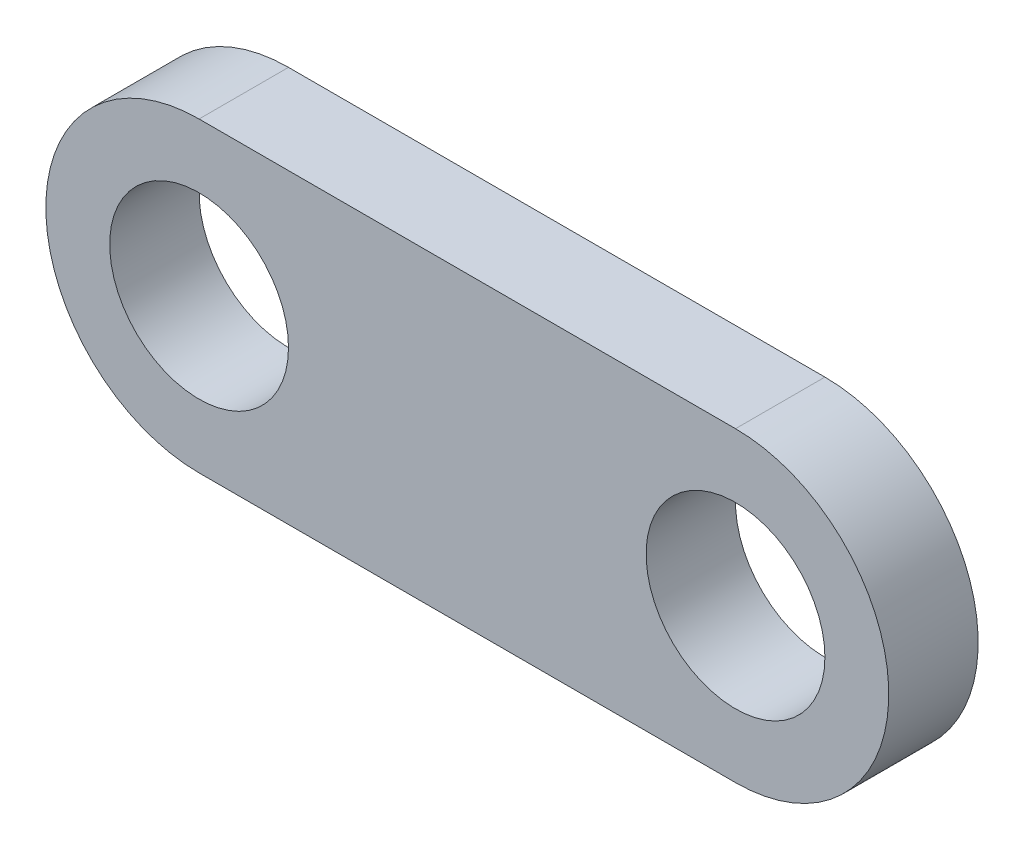
ISO-10303-21;
HEADER;
FILE_DESCRIPTION(('STEP AP214'),'2;1');
FILE_NAME('part.step','',(''),(''),'','','');
FILE_SCHEMA(('AUTOMOTIVE_DESIGN { 1 0 10303 214 1 1 1 1 }'));
ENDSEC;
DATA;
#1=APPLICATION_CONTEXT('core data for automotive mechanical design processes');
#2=APPLICATION_PROTOCOL_DEFINITION('international standard','automotive_design',2000,#1);
#3=PRODUCT_CONTEXT('',#1,'mechanical');
#4=PRODUCT('Part','Part','',(#3));
#5=PRODUCT_RELATED_PRODUCT_CATEGORY('part','',(#4));
#6=PRODUCT_DEFINITION_FORMATION('','',#4);
#7=PRODUCT_DEFINITION_CONTEXT('part definition',#1,'design');
#8=PRODUCT_DEFINITION('design','',#6,#7);
#9=PRODUCT_DEFINITION_SHAPE('','',#8);
#10=(LENGTH_UNIT() NAMED_UNIT(*) SI_UNIT(.MILLI.,.METRE.));
#11=(NAMED_UNIT(*) PLANE_ANGLE_UNIT() SI_UNIT($,.RADIAN.));
#12=(NAMED_UNIT(*) SI_UNIT($,.STERADIAN.) SOLID_ANGLE_UNIT());
#13=UNCERTAINTY_MEASURE_WITH_UNIT(LENGTH_MEASURE(1.E-05),#10,'distance_accuracy_value','');
#14=(GEOMETRIC_REPRESENTATION_CONTEXT(3) GLOBAL_UNCERTAINTY_ASSIGNED_CONTEXT((#13)) GLOBAL_UNIT_ASSIGNED_CONTEXT((#10,
#11,#12)) REPRESENTATION_CONTEXT('',''));
#15=CARTESIAN_POINT('',(0.,0.,0.));
#16=DIRECTION('',(0.,0.,1.));
#17=DIRECTION('',(1.,0.,0.));
#18=AXIS2_PLACEMENT_3D('',#15,#16,#17);
#19=CARTESIAN_POINT('',(0.,0.,7.));
#20=DIRECTION('',(0.,0.,-1.));
#21=DIRECTION('',(-1.,0.,0.));
#22=AXIS2_PLACEMENT_3D('',#19,#20,#21);
#23=CYLINDRICAL_SURFACE('',#22,12.);
#24=CARTESIAN_POINT('',(0.,0.,0.));
#25=DIRECTION('',(0.,0.,-1.));
#26=DIRECTION('',(-1.,0.,0.));
#27=AXIS2_PLACEMENT_3D('',#24,#25,#26);
#28=CIRCLE('',#27,12.);
#29=CARTESIAN_POINT('',(0.,-12.,0.));
#30=VERTEX_POINT('',#29);
#31=CARTESIAN_POINT('',(0.,12.,0.));
#32=VERTEX_POINT('',#31);
#33=EDGE_CURVE('E80',#30,#32,#28,.T.);
#34=ORIENTED_EDGE('',*,*,#33,.F.);
#35=DIRECTION('',(0.,0.,-1.));
#36=VECTOR('',#35,1.);
#37=CARTESIAN_POINT('',(0.,-12.,7.));
#38=LINE('',#37,#36);
#39=CARTESIAN_POINT('',(0.,-12.,7.));
#40=VERTEX_POINT('',#39);
#41=EDGE_CURVE('E11',#40,#30,#38,.T.);
#42=ORIENTED_EDGE('',*,*,#41,.F.);
#43=CARTESIAN_POINT('',(0.,0.,7.));
#44=DIRECTION('',(0.,0.,-1.));
#45=DIRECTION('',(-1.,0.,0.));
#46=AXIS2_PLACEMENT_3D('',#43,#44,#45);
#47=CIRCLE('',#46,12.);
#48=CARTESIAN_POINT('',(0.,12.,7.));
#49=VERTEX_POINT('',#48);
#50=EDGE_CURVE('E82',#40,#49,#47,.T.);
#51=ORIENTED_EDGE('',*,*,#50,.T.);
#52=DIRECTION('',(0.,0.,-1.));
#53=VECTOR('',#52,1.);
#54=CARTESIAN_POINT('',(0.,12.,7.));
#55=LINE('',#54,#53);
#56=EDGE_CURVE('E43',#49,#32,#55,.T.);
#57=ORIENTED_EDGE('',*,*,#56,.T.);
#58=EDGE_LOOP('',(#34,#42,#51,#57));
#59=FACE_BOUND('',#58,.T.);
#60=ADVANCED_FACE('F40',(#59),#23,.T.);
#61=CARTESIAN_POINT('',(42.,-12.,7.));
#62=DIRECTION('',(0.,-1.,0.));
#63=DIRECTION('',(0.,0.,-1.));
#64=AXIS2_PLACEMENT_3D('',#61,#62,#63);
#65=PLANE('',#64);
#66=DIRECTION('',(-1.,0.,0.));
#67=VECTOR('',#66,1.);
#68=CARTESIAN_POINT('',(42.,-12.,0.));
#69=LINE('',#68,#67);
#70=CARTESIAN_POINT('',(42.,-12.,0.));
#71=VERTEX_POINT('',#70);
#72=EDGE_CURVE('E97',#71,#30,#69,.T.);
#73=ORIENTED_EDGE('',*,*,#72,.F.);
#74=DIRECTION('',(0.,0.,-1.));
#75=VECTOR('',#74,1.);
#76=CARTESIAN_POINT('',(42.,-12.,7.));
#77=LINE('',#76,#75);
#78=CARTESIAN_POINT('',(42.,-12.,7.));
#79=VERTEX_POINT('',#78);
#80=EDGE_CURVE('E48',#79,#71,#77,.T.);
#81=ORIENTED_EDGE('',*,*,#80,.F.);
#82=DIRECTION('',(-1.,0.,0.));
#83=VECTOR('',#82,1.);
#84=CARTESIAN_POINT('',(42.,-12.,7.));
#85=LINE('',#84,#83);
#86=EDGE_CURVE('E87',#79,#40,#85,.T.);
#87=ORIENTED_EDGE('',*,*,#86,.T.);
#88=ORIENTED_EDGE('',*,*,#41,.T.);
#89=EDGE_LOOP('',(#73,#81,#87,#88));
#90=FACE_BOUND('',#89,.T.);
#91=ADVANCED_FACE('F117',(#90),#65,.T.);
#92=CARTESIAN_POINT('',(42.,0.,7.));
#93=DIRECTION('',(0.,0.,-1.));
#94=DIRECTION('',(-1.,0.,0.));
#95=AXIS2_PLACEMENT_3D('',#92,#93,#94);
#96=CYLINDRICAL_SURFACE('',#95,12.);
#97=CARTESIAN_POINT('',(42.,0.,0.));
#98=DIRECTION('',(0.,0.,-1.));
#99=DIRECTION('',(-1.,0.,0.));
#100=AXIS2_PLACEMENT_3D('',#97,#98,#99);
#101=CIRCLE('',#100,12.);
#102=CARTESIAN_POINT('',(42.,12.,0.));
#103=VERTEX_POINT('',#102);
#104=EDGE_CURVE('E94',#103,#71,#101,.T.);
#105=ORIENTED_EDGE('',*,*,#104,.F.);
#106=DIRECTION('',(0.,0.,-1.));
#107=VECTOR('',#106,1.);
#108=CARTESIAN_POINT('',(42.,12.,7.));
#109=LINE('',#108,#107);
#110=CARTESIAN_POINT('',(42.,12.,7.));
#111=VERTEX_POINT('',#110);
#112=EDGE_CURVE('E86',#111,#103,#109,.T.);
#113=ORIENTED_EDGE('',*,*,#112,.F.);
#114=CARTESIAN_POINT('',(42.,0.,7.));
#115=DIRECTION('',(0.,0.,-1.));
#116=DIRECTION('',(-1.,0.,0.));
#117=AXIS2_PLACEMENT_3D('',#114,#115,#116);
#118=CIRCLE('',#117,12.);
#119=EDGE_CURVE('E110',#111,#79,#118,.T.);
#120=ORIENTED_EDGE('',*,*,#119,.T.);
#121=ORIENTED_EDGE('',*,*,#80,.T.);
#122=EDGE_LOOP('',(#105,#113,#120,#121));
#123=FACE_BOUND('',#122,.T.);
#124=ADVANCED_FACE('F114',(#123),#96,.T.);
#125=CARTESIAN_POINT('',(0.,12.,7.));
#126=DIRECTION('',(0.,1.,0.));
#127=DIRECTION('',(0.,0.,1.));
#128=AXIS2_PLACEMENT_3D('',#125,#126,#127);
#129=PLANE('',#128);
#130=DIRECTION('',(1.,0.,0.));
#131=VECTOR('',#130,1.);
#132=CARTESIAN_POINT('',(0.,12.,0.));
#133=LINE('',#132,#131);
#134=EDGE_CURVE('E89',#32,#103,#133,.T.);
#135=ORIENTED_EDGE('',*,*,#134,.F.);
#136=ORIENTED_EDGE('',*,*,#56,.F.);
#137=DIRECTION('',(1.,0.,0.));
#138=VECTOR('',#137,1.);
#139=CARTESIAN_POINT('',(0.,12.,7.));
#140=LINE('',#139,#138);
#141=EDGE_CURVE('E108',#49,#111,#140,.T.);
#142=ORIENTED_EDGE('',*,*,#141,.T.);
#143=ORIENTED_EDGE('',*,*,#112,.T.);
#144=EDGE_LOOP('',(#135,#136,#142,#143));
#145=FACE_BOUND('',#144,.T.);
#146=ADVANCED_FACE('F90',(#145),#129,.T.);
#147=CARTESIAN_POINT('',(0.,0.,7.));
#148=DIRECTION('',(0.,0.,-1.));
#149=DIRECTION('',(-1.,0.,0.));
#150=AXIS2_PLACEMENT_3D('',#147,#148,#149);
#151=PLANE('',#150);
#152=CARTESIAN_POINT('',(0.,0.,7.));
#153=DIRECTION('',(0.,0.,-1.));
#154=DIRECTION('',(1.,0.,0.));
#155=AXIS2_PLACEMENT_3D('',#152,#153,#154);
#156=CIRCLE('',#155,7.);
#157=CARTESIAN_POINT('',(7.,0.,7.));
#158=VERTEX_POINT('',#157);
#159=EDGE_CURVE('E185',#158,#158,#156,.T.);
#160=ORIENTED_EDGE('',*,*,#159,.T.);
#161=EDGE_LOOP('',(#160));
#162=FACE_BOUND('',#161,.T.);
#163=CARTESIAN_POINT('',(42.,0.,7.));
#164=DIRECTION('',(0.,0.,-1.));
#165=DIRECTION('',(1.,0.,0.));
#166=AXIS2_PLACEMENT_3D('',#163,#164,#165);
#167=CIRCLE('',#166,7.);
#168=CARTESIAN_POINT('',(49.,0.,7.));
#169=VERTEX_POINT('',#168);
#170=EDGE_CURVE('E98',#169,#169,#167,.T.);
#171=ORIENTED_EDGE('',*,*,#170,.T.);
#172=EDGE_LOOP('',(#171));
#173=FACE_BOUND('',#172,.T.);
#174=ORIENTED_EDGE('',*,*,#50,.F.);
#175=ORIENTED_EDGE('',*,*,#86,.F.);
#176=ORIENTED_EDGE('',*,*,#119,.F.);
#177=ORIENTED_EDGE('',*,*,#141,.F.);
#178=EDGE_LOOP('',(#174,#175,#176,#177));
#179=FACE_BOUND('',#178,.T.);
#180=ADVANCED_FACE('F119',(#162,#173,#179),#151,.F.);
#181=CARTESIAN_POINT('',(0.,0.,0.));
#182=DIRECTION('',(0.,0.,-1.));
#183=DIRECTION('',(-1.,0.,0.));
#184=AXIS2_PLACEMENT_3D('',#181,#182,#183);
#185=PLANE('',#184);
#186=CARTESIAN_POINT('',(0.,0.,0.));
#187=DIRECTION('',(0.,0.,-1.));
#188=DIRECTION('',(1.,0.,0.));
#189=AXIS2_PLACEMENT_3D('',#186,#187,#188);
#190=CIRCLE('',#189,7.);
#191=CARTESIAN_POINT('',(7.,0.,0.));
#192=VERTEX_POINT('',#191);
#193=EDGE_CURVE('E188',#192,#192,#190,.T.);
#194=ORIENTED_EDGE('',*,*,#193,.F.);
#195=EDGE_LOOP('',(#194));
#196=FACE_BOUND('',#195,.T.);
#197=CARTESIAN_POINT('',(42.,0.,0.));
#198=DIRECTION('',(0.,0.,-1.));
#199=DIRECTION('',(1.,0.,0.));
#200=AXIS2_PLACEMENT_3D('',#197,#198,#199);
#201=CIRCLE('',#200,7.);
#202=CARTESIAN_POINT('',(49.,0.,0.));
#203=VERTEX_POINT('',#202);
#204=EDGE_CURVE('E101',#203,#203,#201,.T.);
#205=ORIENTED_EDGE('',*,*,#204,.F.);
#206=EDGE_LOOP('',(#205));
#207=FACE_BOUND('',#206,.T.);
#208=ORIENTED_EDGE('',*,*,#33,.T.);
#209=ORIENTED_EDGE('',*,*,#134,.T.);
#210=ORIENTED_EDGE('',*,*,#104,.T.);
#211=ORIENTED_EDGE('',*,*,#72,.T.);
#212=EDGE_LOOP('',(#208,#209,#210,#211));
#213=FACE_BOUND('',#212,.T.);
#214=ADVANCED_FACE('F96',(#196,#207,#213),#185,.T.);
#215=CARTESIAN_POINT('',(42.,0.,7.));
#216=DIRECTION('',(0.,0.,-1.));
#217=DIRECTION('',(-1.,0.,0.));
#218=AXIS2_PLACEMENT_3D('',#215,#216,#217);
#219=CYLINDRICAL_SURFACE('',#218,7.);
#220=ORIENTED_EDGE('',*,*,#170,.F.);
#221=EDGE_LOOP('',(#220));
#222=FACE_BOUND('',#221,.T.);
#223=ORIENTED_EDGE('',*,*,#204,.T.);
#224=EDGE_LOOP('',(#223));
#225=FACE_BOUND('',#224,.T.);
#226=ADVANCED_FACE('F127',(#222,#225),#219,.F.);
#227=CARTESIAN_POINT('',(0.,0.,7.));
#228=DIRECTION('',(0.,0.,-1.));
#229=DIRECTION('',(-1.,0.,0.));
#230=AXIS2_PLACEMENT_3D('',#227,#228,#229);
#231=CYLINDRICAL_SURFACE('',#230,7.);
#232=ORIENTED_EDGE('',*,*,#159,.F.);
#233=EDGE_LOOP('',(#232));
#234=FACE_BOUND('',#233,.T.);
#235=ORIENTED_EDGE('',*,*,#193,.T.);
#236=EDGE_LOOP('',(#235));
#237=FACE_BOUND('',#236,.T.);
#238=ADVANCED_FACE('F169',(#234,#237),#231,.F.);
#239=CLOSED_SHELL('',(#60,#91,#124,#146,#180,#214,#226,#238));
#240=MANIFOLD_SOLID_BREP('B2',#239);
#241=ADVANCED_BREP_SHAPE_REPRESENTATION('',(#18,#240),#14);
#242=SHAPE_DEFINITION_REPRESENTATION(#9,#241);
ENDSEC;
END-ISO-10303-21;
